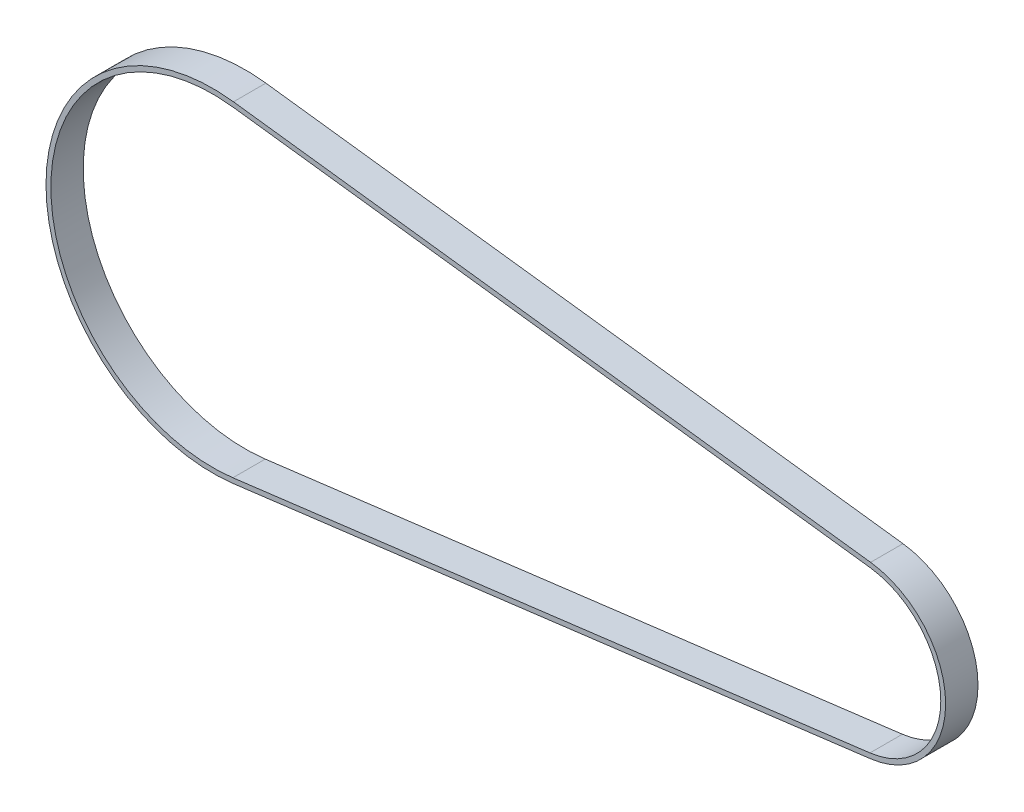
ISO-10303-21;
HEADER;
FILE_DESCRIPTION(('STEP AP214'),'2;1');
FILE_NAME('part.step','',(''),(''),'','','');
FILE_SCHEMA(('AUTOMOTIVE_DESIGN { 1 0 10303 214 1 1 1 1 }'));
ENDSEC;
DATA;
#1=APPLICATION_CONTEXT('core data for automotive mechanical design processes');
#2=APPLICATION_PROTOCOL_DEFINITION('international standard','automotive_design',2000,#1);
#3=PRODUCT_CONTEXT('',#1,'mechanical');
#4=PRODUCT('Part','Part','',(#3));
#5=PRODUCT_RELATED_PRODUCT_CATEGORY('part','',(#4));
#6=PRODUCT_DEFINITION_FORMATION('','',#4);
#7=PRODUCT_DEFINITION_CONTEXT('part definition',#1,'design');
#8=PRODUCT_DEFINITION('design','',#6,#7);
#9=PRODUCT_DEFINITION_SHAPE('','',#8);
#10=(LENGTH_UNIT() NAMED_UNIT(*) SI_UNIT(.MILLI.,.METRE.));
#11=(NAMED_UNIT(*) PLANE_ANGLE_UNIT() SI_UNIT($,.RADIAN.));
#12=(NAMED_UNIT(*) SI_UNIT($,.STERADIAN.) SOLID_ANGLE_UNIT());
#13=UNCERTAINTY_MEASURE_WITH_UNIT(LENGTH_MEASURE(1.E-05),#10,'distance_accuracy_value','');
#14=(GEOMETRIC_REPRESENTATION_CONTEXT(3) GLOBAL_UNCERTAINTY_ASSIGNED_CONTEXT((#13)) GLOBAL_UNIT_ASSIGNED_CONTEXT((#10,
#11,#12)) REPRESENTATION_CONTEXT('',''));
#15=CARTESIAN_POINT('',(0.,0.,0.));
#16=DIRECTION('',(0.,0.,1.));
#17=DIRECTION('',(1.,0.,0.));
#18=AXIS2_PLACEMENT_3D('',#15,#16,#17);
#19=CARTESIAN_POINT('',(-400.,0.,10.));
#20=DIRECTION('',(0.,0.,1.));
#21=DIRECTION('',(1.,0.,0.));
#22=AXIS2_PLACEMENT_3D('',#19,#20,#21);
#23=PLANE('',#22);
#24=CARTESIAN_POINT('',(-400.,0.,10.));
#25=DIRECTION('',(0.,0.,1.));
#26=DIRECTION('',(1.,0.,0.));
#27=AXIS2_PLACEMENT_3D('',#24,#25,#26);
#28=CIRCLE('',#27,103.);
#29=CARTESIAN_POINT('',(-387.125,102.19214438987,9.99999999999999));
#30=VERTEX_POINT('',#29);
#31=CARTESIAN_POINT('',(-387.125,-102.19214438987,10.));
#32=VERTEX_POINT('',#31);
#33=EDGE_CURVE('E162',#30,#32,#28,.T.);
#34=ORIENTED_EDGE('',*,*,#33,.T.);
#35=DIRECTION('',(0.992156741649222,0.125,0.));
#36=VECTOR('',#35,1.);
#37=CARTESIAN_POINT('',(-387.125,-102.19214438987,10.));
#38=LINE('',#37,#36);
#39=CARTESIAN_POINT('',(6.62500000000016,-52.5843073074088,10.));
#40=VERTEX_POINT('',#39);
#41=EDGE_CURVE('E165',#32,#40,#38,.T.);
#42=ORIENTED_EDGE('',*,*,#41,.T.);
#43=CARTESIAN_POINT('',(0.,0.,10.));
#44=DIRECTION('',(0.,0.,1.));
#45=DIRECTION('',(1.,0.,0.));
#46=AXIS2_PLACEMENT_3D('',#43,#44,#45);
#47=CIRCLE('',#46,53.);
#48=CARTESIAN_POINT('',(6.62500000000001,52.5843073074088,10.));
#49=VERTEX_POINT('',#48);
#50=EDGE_CURVE('E168',#40,#49,#47,.T.);
#51=ORIENTED_EDGE('',*,*,#50,.T.);
#52=DIRECTION('',(-0.992156741649222,0.125,0.));
#53=VECTOR('',#52,1.);
#54=CARTESIAN_POINT('',(-387.125,102.19214438987,10.));
#55=LINE('',#54,#53);
#56=EDGE_CURVE('E170',#49,#30,#55,.T.);
#57=ORIENTED_EDGE('',*,*,#56,.T.);
#58=EDGE_LOOP('',(#34,#42,#51,#57));
#59=FACE_BOUND('',#58,.T.);
#60=DIRECTION('',(0.992156741649221,0.125,0.));
#61=VECTOR('',#60,1.);
#62=CARTESIAN_POINT('',(-387.5,-99.2156741649222,10.));
#63=LINE('',#62,#61);
#64=CARTESIAN_POINT('',(-387.5,-99.2156741649222,10.));
#65=VERTEX_POINT('',#64);
#66=CARTESIAN_POINT('',(6.25000000000001,-49.6078370824611,10.));
#67=VERTEX_POINT('',#66);
#68=EDGE_CURVE('E134',#65,#67,#63,.T.);
#69=ORIENTED_EDGE('',*,*,#68,.F.);
#70=CARTESIAN_POINT('',(-400.,0.,10.));
#71=DIRECTION('',(0.,0.,1.));
#72=DIRECTION('',(1.,0.,0.));
#73=AXIS2_PLACEMENT_3D('',#70,#71,#72);
#74=CIRCLE('',#73,100.);
#75=CARTESIAN_POINT('',(-387.5,99.2156741649222,10.));
#76=VERTEX_POINT('',#75);
#77=EDGE_CURVE('E126',#76,#65,#74,.T.);
#78=ORIENTED_EDGE('',*,*,#77,.F.);
#79=DIRECTION('',(-0.992156741649221,0.125,0.));
#80=VECTOR('',#79,1.);
#81=CARTESIAN_POINT('',(-387.5,99.2156741649222,10.));
#82=LINE('',#81,#80);
#83=CARTESIAN_POINT('',(6.25000000000003,49.6078370824611,10.));
#84=VERTEX_POINT('',#83);
#85=EDGE_CURVE('E148',#84,#76,#82,.T.);
#86=ORIENTED_EDGE('',*,*,#85,.F.);
#87=CARTESIAN_POINT('',(0.,0.,10.));
#88=DIRECTION('',(0.,0.,1.));
#89=DIRECTION('',(1.,0.,0.));
#90=AXIS2_PLACEMENT_3D('',#87,#88,#89);
#91=CIRCLE('',#90,50.);
#92=EDGE_CURVE('E146',#67,#84,#91,.T.);
#93=ORIENTED_EDGE('',*,*,#92,.F.);
#94=EDGE_LOOP('',(#69,#78,#86,#93));
#95=FACE_BOUND('',#94,.T.);
#96=ADVANCED_FACE('F61',(#59,#95),#23,.T.);
#97=CARTESIAN_POINT('',(-400.,0.,-10.));
#98=DIRECTION('',(0.,0.,1.));
#99=DIRECTION('',(1.,0.,0.));
#100=AXIS2_PLACEMENT_3D('',#97,#98,#99);
#101=PLANE('',#100);
#102=CARTESIAN_POINT('',(-400.,0.,-10.));
#103=DIRECTION('',(0.,0.,1.));
#104=DIRECTION('',(1.,0.,0.));
#105=AXIS2_PLACEMENT_3D('',#102,#103,#104);
#106=CIRCLE('',#105,103.);
#107=CARTESIAN_POINT('',(-387.125,102.19214438987,-10.));
#108=VERTEX_POINT('',#107);
#109=CARTESIAN_POINT('',(-387.125,-102.19214438987,-10.));
#110=VERTEX_POINT('',#109);
#111=EDGE_CURVE('E142',#108,#110,#106,.T.);
#112=ORIENTED_EDGE('',*,*,#111,.F.);
#113=DIRECTION('',(-0.992156741649222,0.125,0.));
#114=VECTOR('',#113,1.);
#115=CARTESIAN_POINT('',(-387.125,102.19214438987,-10.));
#116=LINE('',#115,#114);
#117=CARTESIAN_POINT('',(6.62500000000001,52.5843073074088,-10.));
#118=VERTEX_POINT('',#117);
#119=EDGE_CURVE('E166',#118,#108,#116,.T.);
#120=ORIENTED_EDGE('',*,*,#119,.F.);
#121=CARTESIAN_POINT('',(0.,0.,-10.));
#122=DIRECTION('',(0.,0.,1.));
#123=DIRECTION('',(1.,0.,0.));
#124=AXIS2_PLACEMENT_3D('',#121,#122,#123);
#125=CIRCLE('',#124,53.);
#126=CARTESIAN_POINT('',(6.62500000000016,-52.5843073074088,-10.));
#127=VERTEX_POINT('',#126);
#128=EDGE_CURVE('E177',#127,#118,#125,.T.);
#129=ORIENTED_EDGE('',*,*,#128,.F.);
#130=DIRECTION('',(0.992156741649222,0.125,0.));
#131=VECTOR('',#130,1.);
#132=CARTESIAN_POINT('',(-387.125,-102.19214438987,-10.));
#133=LINE('',#132,#131);
#134=EDGE_CURVE('E175',#110,#127,#133,.T.);
#135=ORIENTED_EDGE('',*,*,#134,.F.);
#136=EDGE_LOOP('',(#112,#120,#129,#135));
#137=FACE_BOUND('',#136,.T.);
#138=CARTESIAN_POINT('',(-400.,0.,-10.));
#139=DIRECTION('',(0.,0.,1.));
#140=DIRECTION('',(1.,0.,0.));
#141=AXIS2_PLACEMENT_3D('',#138,#139,#140);
#142=CIRCLE('',#141,100.);
#143=CARTESIAN_POINT('',(-387.5,99.2156741649222,-10.));
#144=VERTEX_POINT('',#143);
#145=CARTESIAN_POINT('',(-387.5,-99.2156741649222,-10.));
#146=VERTEX_POINT('',#145);
#147=EDGE_CURVE('E84',#144,#146,#142,.T.);
#148=ORIENTED_EDGE('',*,*,#147,.T.);
#149=DIRECTION('',(0.992156741649221,0.125,0.));
#150=VECTOR('',#149,1.);
#151=CARTESIAN_POINT('',(-387.5,-99.2156741649222,-10.));
#152=LINE('',#151,#150);
#153=CARTESIAN_POINT('',(6.25000000000001,-49.6078370824611,-10.));
#154=VERTEX_POINT('',#153);
#155=EDGE_CURVE('E141',#146,#154,#152,.T.);
#156=ORIENTED_EDGE('',*,*,#155,.T.);
#157=CARTESIAN_POINT('',(0.,0.,-10.));
#158=DIRECTION('',(0.,0.,1.));
#159=DIRECTION('',(1.,0.,0.));
#160=AXIS2_PLACEMENT_3D('',#157,#158,#159);
#161=CIRCLE('',#160,50.);
#162=CARTESIAN_POINT('',(6.25000000000001,49.6078370824611,-10.));
#163=VERTEX_POINT('',#162);
#164=EDGE_CURVE('E154',#154,#163,#161,.T.);
#165=ORIENTED_EDGE('',*,*,#164,.T.);
#166=DIRECTION('',(-0.992156741649221,0.125,0.));
#167=VECTOR('',#166,1.);
#168=CARTESIAN_POINT('',(-387.5,99.2156741649222,-10.));
#169=LINE('',#168,#167);
#170=EDGE_CURVE('E135',#163,#144,#169,.T.);
#171=ORIENTED_EDGE('',*,*,#170,.T.);
#172=EDGE_LOOP('',(#148,#156,#165,#171));
#173=FACE_BOUND('',#172,.T.);
#174=ADVANCED_FACE('F195',(#137,#173),#101,.F.);
#175=CARTESIAN_POINT('',(-400.,0.,10.));
#176=DIRECTION('',(0.,0.,-1.));
#177=DIRECTION('',(-1.,0.,0.));
#178=AXIS2_PLACEMENT_3D('',#175,#176,#177);
#179=CYLINDRICAL_SURFACE('',#178,103.);
#180=ORIENTED_EDGE('',*,*,#111,.T.);
#181=DIRECTION('',(0.,0.,-1.));
#182=VECTOR('',#181,1.);
#183=CARTESIAN_POINT('',(-387.125,-102.19214438987,10.));
#184=LINE('',#183,#182);
#185=EDGE_CURVE('E12',#32,#110,#184,.T.);
#186=ORIENTED_EDGE('',*,*,#185,.F.);
#187=ORIENTED_EDGE('',*,*,#33,.F.);
#188=DIRECTION('',(0.,0.,-1.));
#189=VECTOR('',#188,1.);
#190=CARTESIAN_POINT('',(-387.125,102.19214438987,9.99999999999999));
#191=LINE('',#190,#189);
#192=EDGE_CURVE('E172',#30,#108,#191,.T.);
#193=ORIENTED_EDGE('',*,*,#192,.T.);
#194=EDGE_LOOP('',(#180,#186,#187,#193));
#195=FACE_BOUND('',#194,.T.);
#196=ADVANCED_FACE('F63',(#195),#179,.T.);
#197=CARTESIAN_POINT('',(-387.125,-102.19214438987,10.));
#198=DIRECTION('',(-0.125,0.992156741649222,0.));
#199=DIRECTION('',(-0.992156741649222,-0.125,0.));
#200=AXIS2_PLACEMENT_3D('',#197,#198,#199);
#201=PLANE('',#200);
#202=ORIENTED_EDGE('',*,*,#134,.T.);
#203=DIRECTION('',(0.,0.,-1.));
#204=VECTOR('',#203,1.);
#205=CARTESIAN_POINT('',(6.62500000000016,-52.5843073074088,10.));
#206=LINE('',#205,#204);
#207=EDGE_CURVE('E69',#40,#127,#206,.T.);
#208=ORIENTED_EDGE('',*,*,#207,.F.);
#209=ORIENTED_EDGE('',*,*,#41,.F.);
#210=ORIENTED_EDGE('',*,*,#185,.T.);
#211=EDGE_LOOP('',(#202,#208,#209,#210));
#212=FACE_BOUND('',#211,.T.);
#213=ADVANCED_FACE('F205',(#212),#201,.F.);
#214=CARTESIAN_POINT('',(0.,0.,10.));
#215=DIRECTION('',(0.,0.,-1.));
#216=DIRECTION('',(-1.,0.,0.));
#217=AXIS2_PLACEMENT_3D('',#214,#215,#216);
#218=CYLINDRICAL_SURFACE('',#217,53.);
#219=ORIENTED_EDGE('',*,*,#128,.T.);
#220=DIRECTION('',(0.,0.,-1.));
#221=VECTOR('',#220,1.);
#222=CARTESIAN_POINT('',(6.62500000000001,52.5843073074088,10.));
#223=LINE('',#222,#221);
#224=EDGE_CURVE('E182',#49,#118,#223,.T.);
#225=ORIENTED_EDGE('',*,*,#224,.F.);
#226=ORIENTED_EDGE('',*,*,#50,.F.);
#227=ORIENTED_EDGE('',*,*,#207,.T.);
#228=EDGE_LOOP('',(#219,#225,#226,#227));
#229=FACE_BOUND('',#228,.T.);
#230=ADVANCED_FACE('F189',(#229),#218,.T.);
#231=CARTESIAN_POINT('',(-387.125,102.19214438987,10.));
#232=DIRECTION('',(-0.125,-0.992156741649222,0.));
#233=DIRECTION('',(0.992156741649222,-0.125,0.));
#234=AXIS2_PLACEMENT_3D('',#231,#232,#233);
#235=PLANE('',#234);
#236=ORIENTED_EDGE('',*,*,#119,.T.);
#237=ORIENTED_EDGE('',*,*,#192,.F.);
#238=ORIENTED_EDGE('',*,*,#56,.F.);
#239=ORIENTED_EDGE('',*,*,#224,.T.);
#240=EDGE_LOOP('',(#236,#237,#238,#239));
#241=FACE_BOUND('',#240,.T.);
#242=ADVANCED_FACE('F199',(#241),#235,.F.);
#243=CARTESIAN_POINT('',(-400.,0.,10.));
#244=DIRECTION('',(0.,0.,-1.));
#245=DIRECTION('',(-1.,0.,0.));
#246=AXIS2_PLACEMENT_3D('',#243,#244,#245);
#247=CYLINDRICAL_SURFACE('',#246,100.);
#248=ORIENTED_EDGE('',*,*,#147,.F.);
#249=DIRECTION('',(0.,0.,-1.));
#250=VECTOR('',#249,1.);
#251=CARTESIAN_POINT('',(-387.5,99.2156741649222,10.));
#252=LINE('',#251,#250);
#253=EDGE_CURVE('E130',#76,#144,#252,.T.);
#254=ORIENTED_EDGE('',*,*,#253,.F.);
#255=ORIENTED_EDGE('',*,*,#77,.T.);
#256=DIRECTION('',(0.,0.,-1.));
#257=VECTOR('',#256,1.);
#258=CARTESIAN_POINT('',(-387.5,-99.2156741649222,10.));
#259=LINE('',#258,#257);
#260=EDGE_CURVE('E129',#65,#146,#259,.T.);
#261=ORIENTED_EDGE('',*,*,#260,.T.);
#262=EDGE_LOOP('',(#248,#254,#255,#261));
#263=FACE_BOUND('',#262,.T.);
#264=ADVANCED_FACE('F128',(#263),#247,.F.);
#265=CARTESIAN_POINT('',(-387.5,-99.2156741649222,10.));
#266=DIRECTION('',(-0.125,0.992156741649222,0.));
#267=DIRECTION('',(-0.992156741649222,-0.125,0.));
#268=AXIS2_PLACEMENT_3D('',#265,#266,#267);
#269=PLANE('',#268);
#270=ORIENTED_EDGE('',*,*,#155,.F.);
#271=ORIENTED_EDGE('',*,*,#260,.F.);
#272=ORIENTED_EDGE('',*,*,#68,.T.);
#273=DIRECTION('',(0.,0.,-1.));
#274=VECTOR('',#273,1.);
#275=CARTESIAN_POINT('',(6.25000000000001,-49.6078370824611,10.));
#276=LINE('',#275,#274);
#277=EDGE_CURVE('E143',#67,#154,#276,.T.);
#278=ORIENTED_EDGE('',*,*,#277,.T.);
#279=EDGE_LOOP('',(#270,#271,#272,#278));
#280=FACE_BOUND('',#279,.T.);
#281=ADVANCED_FACE('F138',(#280),#269,.T.);
#282=CARTESIAN_POINT('',(0.,0.,10.));
#283=DIRECTION('',(0.,0.,-1.));
#284=DIRECTION('',(-1.,0.,0.));
#285=AXIS2_PLACEMENT_3D('',#282,#283,#284);
#286=CYLINDRICAL_SURFACE('',#285,50.);
#287=ORIENTED_EDGE('',*,*,#164,.F.);
#288=ORIENTED_EDGE('',*,*,#277,.F.);
#289=ORIENTED_EDGE('',*,*,#92,.T.);
#290=DIRECTION('',(0.,0.,-1.));
#291=VECTOR('',#290,1.);
#292=CARTESIAN_POINT('',(6.25000000000001,49.6078370824611,10.));
#293=LINE('',#292,#291);
#294=EDGE_CURVE('E76',#84,#163,#293,.T.);
#295=ORIENTED_EDGE('',*,*,#294,.T.);
#296=EDGE_LOOP('',(#287,#288,#289,#295));
#297=FACE_BOUND('',#296,.T.);
#298=ADVANCED_FACE('F228',(#297),#286,.F.);
#299=CARTESIAN_POINT('',(-387.5,99.2156741649222,10.));
#300=DIRECTION('',(-0.125,-0.992156741649222,0.));
#301=DIRECTION('',(0.992156741649222,-0.125,0.));
#302=AXIS2_PLACEMENT_3D('',#299,#300,#301);
#303=PLANE('',#302);
#304=ORIENTED_EDGE('',*,*,#170,.F.);
#305=ORIENTED_EDGE('',*,*,#294,.F.);
#306=ORIENTED_EDGE('',*,*,#85,.T.);
#307=ORIENTED_EDGE('',*,*,#253,.T.);
#308=EDGE_LOOP('',(#304,#305,#306,#307));
#309=FACE_BOUND('',#308,.T.);
#310=ADVANCED_FACE('F232',(#309),#303,.T.);
#311=CLOSED_SHELL('',(#96,#174,#196,#213,#230,#242,#264,#281,#298,#310));
#312=MANIFOLD_SOLID_BREP('B2',#311);
#313=ADVANCED_BREP_SHAPE_REPRESENTATION('',(#18,#312),#14);
#314=SHAPE_DEFINITION_REPRESENTATION(#9,#313);
ENDSEC;
END-ISO-10303-21;
